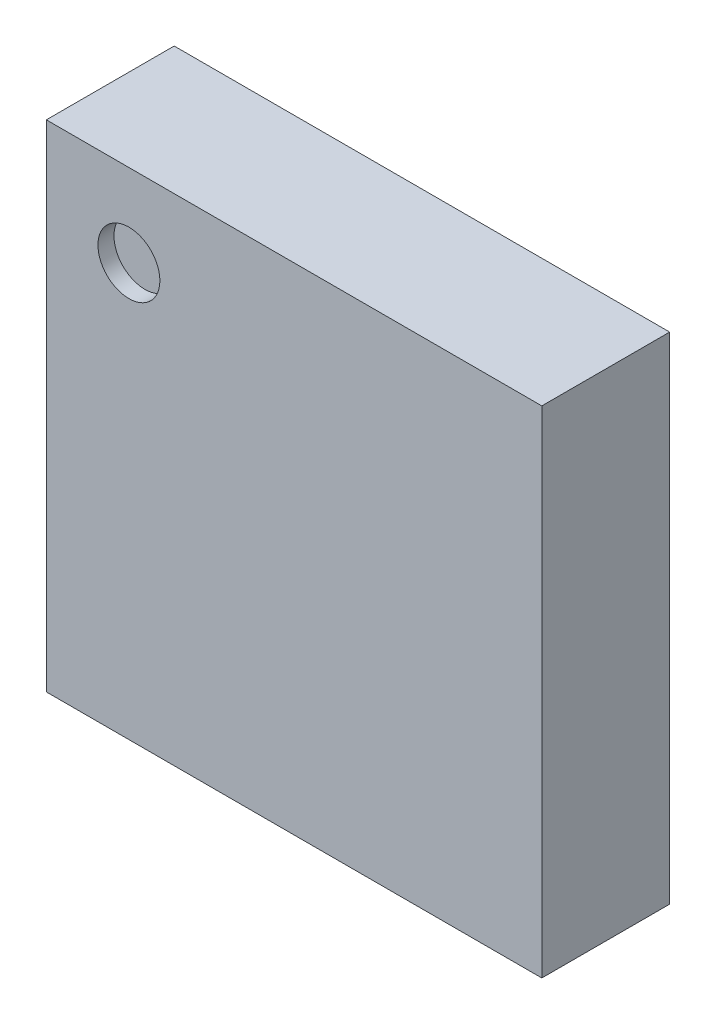
ISO-10303-21;
HEADER;
FILE_DESCRIPTION(('STEP AP214'),'2;1');
FILE_NAME('part.step','',(''),(''),'','','');
FILE_SCHEMA(('AUTOMOTIVE_DESIGN { 1 0 10303 214 1 1 1 1 }'));
ENDSEC;
DATA;
#1=APPLICATION_CONTEXT('core data for automotive mechanical design processes');
#2=APPLICATION_PROTOCOL_DEFINITION('international standard','automotive_design',2000,#1);
#3=PRODUCT_CONTEXT('',#1,'mechanical');
#4=PRODUCT('Part','Part','',(#3));
#5=PRODUCT_RELATED_PRODUCT_CATEGORY('part','',(#4));
#6=PRODUCT_DEFINITION_FORMATION('','',#4);
#7=PRODUCT_DEFINITION_CONTEXT('part definition',#1,'design');
#8=PRODUCT_DEFINITION('design','',#6,#7);
#9=PRODUCT_DEFINITION_SHAPE('','',#8);
#10=(LENGTH_UNIT() NAMED_UNIT(*) SI_UNIT(.MILLI.,.METRE.));
#11=(NAMED_UNIT(*) PLANE_ANGLE_UNIT() SI_UNIT($,.RADIAN.));
#12=(NAMED_UNIT(*) SI_UNIT($,.STERADIAN.) SOLID_ANGLE_UNIT());
#13=UNCERTAINTY_MEASURE_WITH_UNIT(LENGTH_MEASURE(1.E-05),#10,'distance_accuracy_value','');
#14=(GEOMETRIC_REPRESENTATION_CONTEXT(3) GLOBAL_UNCERTAINTY_ASSIGNED_CONTEXT((#13)) GLOBAL_UNIT_ASSIGNED_CONTEXT((#10,
#11,#12)) REPRESENTATION_CONTEXT('',''));
#15=CARTESIAN_POINT('',(0.,0.,0.));
#16=DIRECTION('',(0.,0.,1.));
#17=DIRECTION('',(1.,0.,0.));
#18=AXIS2_PLACEMENT_3D('',#15,#16,#17);
#19=CARTESIAN_POINT('',(0.516666666667,2.583333333333,0.7));
#20=DIRECTION('',(0.,0.,1.));
#21=DIRECTION('',(1.,0.,0.));
#22=AXIS2_PLACEMENT_3D('',#19,#20,#21);
#23=PLANE('',#22);
#24=CARTESIAN_POINT('',(0.516666666667,2.583333333333,0.7));
#25=DIRECTION('',(0.,0.,1.));
#26=DIRECTION('',(1.,0.,0.));
#27=AXIS2_PLACEMENT_3D('',#24,#25,#26);
#28=CIRCLE('',#27,0.19375);
#29=CARTESIAN_POINT('',(0.710416666667,2.583333333333,0.7));
#30=VERTEX_POINT('',#29);
#31=EDGE_CURVE('E20',#30,#30,#28,.T.);
#32=ORIENTED_EDGE('',*,*,#31,.T.);
#33=EDGE_LOOP('',(#32));
#34=FACE_BOUND('',#33,.T.);
#35=ADVANCED_FACE('F17',(#34),#23,.T.);
#36=CARTESIAN_POINT('',(0.516666666667,2.583333333333,0.7));
#37=DIRECTION('',(0.,0.,1.));
#38=DIRECTION('',(1.,0.,0.));
#39=AXIS2_PLACEMENT_3D('',#36,#37,#38);
#40=CYLINDRICAL_SURFACE('',#39,0.19375);
#41=CARTESIAN_POINT('',(0.516666666667,2.583333333333,0.8));
#42=DIRECTION('',(0.,0.,1.));
#43=DIRECTION('',(1.,0.,0.));
#44=AXIS2_PLACEMENT_3D('',#41,#42,#43);
#45=CIRCLE('',#44,0.19375);
#46=CARTESIAN_POINT('',(0.710416666667,2.583333333333,0.8));
#47=VERTEX_POINT('',#46);
#48=EDGE_CURVE('E66',#47,#47,#45,.F.);
#49=ORIENTED_EDGE('',*,*,#48,.F.);
#50=EDGE_LOOP('',(#49));
#51=FACE_BOUND('',#50,.T.);
#52=ORIENTED_EDGE('',*,*,#31,.F.);
#53=EDGE_LOOP('',(#52));
#54=FACE_BOUND('',#53,.T.);
#55=ADVANCED_FACE('F87',(#51,#54),#40,.F.);
#56=CARTESIAN_POINT('',(0.,0.,0.8));
#57=DIRECTION('',(0.,0.,1.));
#58=DIRECTION('',(1.,0.,0.));
#59=AXIS2_PLACEMENT_3D('',#56,#57,#58);
#60=PLANE('',#59);
#61=ORIENTED_EDGE('',*,*,#48,.T.);
#62=EDGE_LOOP('',(#61));
#63=FACE_BOUND('',#62,.T.);
#64=DIRECTION('',(0.,1.,0.));
#65=VECTOR('',#64,1.);
#66=CARTESIAN_POINT('',(3.1,0.,0.8));
#67=LINE('',#66,#65);
#68=CARTESIAN_POINT('',(3.1,3.1,0.8));
#69=VERTEX_POINT('',#68);
#70=CARTESIAN_POINT('',(3.1,0.,0.8));
#71=VERTEX_POINT('',#70);
#72=EDGE_CURVE('E166',#69,#71,#67,.F.);
#73=ORIENTED_EDGE('',*,*,#72,.F.);
#74=DIRECTION('',(1.,0.,0.));
#75=VECTOR('',#74,1.);
#76=CARTESIAN_POINT('',(0.,3.1,0.8));
#77=LINE('',#76,#75);
#78=CARTESIAN_POINT('',(0.,3.1,0.8));
#79=VERTEX_POINT('',#78);
#80=EDGE_CURVE('E60',#79,#69,#77,.T.);
#81=ORIENTED_EDGE('',*,*,#80,.F.);
#82=DIRECTION('',(0.,1.,0.));
#83=VECTOR('',#82,1.);
#84=CARTESIAN_POINT('',(0.,0.,0.8));
#85=LINE('',#84,#83);
#86=CARTESIAN_POINT('',(0.,0.,0.8));
#87=VERTEX_POINT('',#86);
#88=EDGE_CURVE('E58',#79,#87,#85,.F.);
#89=ORIENTED_EDGE('',*,*,#88,.T.);
#90=DIRECTION('',(1.,0.,0.));
#91=VECTOR('',#90,1.);
#92=CARTESIAN_POINT('',(0.,0.,0.8));
#93=LINE('',#92,#91);
#94=EDGE_CURVE('E55',#87,#71,#93,.T.);
#95=ORIENTED_EDGE('',*,*,#94,.T.);
#96=EDGE_LOOP('',(#73,#81,#89,#95));
#97=FACE_BOUND('',#96,.T.);
#98=ADVANCED_FACE('F59',(#63,#97),#60,.T.);
#99=CARTESIAN_POINT('',(0.,0.,0.));
#100=DIRECTION('',(1.,0.,0.));
#101=DIRECTION('',(0.,0.,-1.));
#102=AXIS2_PLACEMENT_3D('',#99,#100,#101);
#103=PLANE('',#102);
#104=DIRECTION('',(0.,0.,1.));
#105=VECTOR('',#104,1.);
#106=CARTESIAN_POINT('',(0.,3.1,0.));
#107=LINE('',#106,#105);
#108=CARTESIAN_POINT('',(0.,3.1,0.));
#109=VERTEX_POINT('',#108);
#110=EDGE_CURVE('E170',#109,#79,#107,.T.);
#111=ORIENTED_EDGE('',*,*,#110,.F.);
#112=DIRECTION('',(0.,1.,0.));
#113=VECTOR('',#112,1.);
#114=CARTESIAN_POINT('',(0.,0.,0.));
#115=LINE('',#114,#113);
#116=CARTESIAN_POINT('',(0.,0.,0.));
#117=VERTEX_POINT('',#116);
#118=EDGE_CURVE('E77',#109,#117,#115,.F.);
#119=ORIENTED_EDGE('',*,*,#118,.T.);
#120=DIRECTION('',(0.,0.,1.));
#121=VECTOR('',#120,1.);
#122=CARTESIAN_POINT('',(0.,0.,0.));
#123=LINE('',#122,#121);
#124=EDGE_CURVE('E65',#117,#87,#123,.T.);
#125=ORIENTED_EDGE('',*,*,#124,.T.);
#126=ORIENTED_EDGE('',*,*,#88,.F.);
#127=EDGE_LOOP('',(#111,#119,#125,#126));
#128=FACE_BOUND('',#127,.T.);
#129=ADVANCED_FACE('F76',(#128),#103,.F.);
#130=CARTESIAN_POINT('',(0.,0.,0.));
#131=DIRECTION('',(0.,1.,0.));
#132=DIRECTION('',(0.,0.,1.));
#133=AXIS2_PLACEMENT_3D('',#130,#131,#132);
#134=PLANE('',#133);
#135=ORIENTED_EDGE('',*,*,#94,.F.);
#136=ORIENTED_EDGE('',*,*,#124,.F.);
#137=DIRECTION('',(1.,0.,0.));
#138=VECTOR('',#137,1.);
#139=CARTESIAN_POINT('',(0.,0.,0.));
#140=LINE('',#139,#138);
#141=CARTESIAN_POINT('',(3.1,0.,0.));
#142=VERTEX_POINT('',#141);
#143=EDGE_CURVE('E168',#117,#142,#140,.T.);
#144=ORIENTED_EDGE('',*,*,#143,.T.);
#145=DIRECTION('',(0.,0.,-1.));
#146=VECTOR('',#145,1.);
#147=CARTESIAN_POINT('',(3.1,0.,0.));
#148=LINE('',#147,#146);
#149=EDGE_CURVE('E73',#71,#142,#148,.T.);
#150=ORIENTED_EDGE('',*,*,#149,.F.);
#151=EDGE_LOOP('',(#135,#136,#144,#150));
#152=FACE_BOUND('',#151,.T.);
#153=ADVANCED_FACE('F70',(#152),#134,.F.);
#154=CARTESIAN_POINT('',(3.1,0.,0.));
#155=DIRECTION('',(1.,0.,0.));
#156=DIRECTION('',(0.,0.,-1.));
#157=AXIS2_PLACEMENT_3D('',#154,#155,#156);
#158=PLANE('',#157);
#159=DIRECTION('',(0.,0.,1.));
#160=VECTOR('',#159,1.);
#161=CARTESIAN_POINT('',(3.1,3.1,0.));
#162=LINE('',#161,#160);
#163=CARTESIAN_POINT('',(3.1,3.1,0.));
#164=VERTEX_POINT('',#163);
#165=EDGE_CURVE('E34',#69,#164,#162,.F.);
#166=ORIENTED_EDGE('',*,*,#165,.F.);
#167=ORIENTED_EDGE('',*,*,#72,.T.);
#168=ORIENTED_EDGE('',*,*,#149,.T.);
#169=DIRECTION('',(0.,1.,0.));
#170=VECTOR('',#169,1.);
#171=CARTESIAN_POINT('',(3.1,0.,0.));
#172=LINE('',#171,#170);
#173=EDGE_CURVE('E26',#142,#164,#172,.T.);
#174=ORIENTED_EDGE('',*,*,#173,.T.);
#175=EDGE_LOOP('',(#166,#167,#168,#174));
#176=FACE_BOUND('',#175,.T.);
#177=ADVANCED_FACE('F104',(#176),#158,.T.);
#178=CARTESIAN_POINT('',(0.,3.1,0.));
#179=DIRECTION('',(0.,1.,0.));
#180=DIRECTION('',(0.,0.,1.));
#181=AXIS2_PLACEMENT_3D('',#178,#179,#180);
#182=PLANE('',#181);
#183=ORIENTED_EDGE('',*,*,#80,.T.);
#184=ORIENTED_EDGE('',*,*,#165,.T.);
#185=DIRECTION('',(1.,0.,0.));
#186=VECTOR('',#185,1.);
#187=CARTESIAN_POINT('',(0.,3.1,0.));
#188=LINE('',#187,#186);
#189=EDGE_CURVE('E11',#164,#109,#188,.F.);
#190=ORIENTED_EDGE('',*,*,#189,.T.);
#191=ORIENTED_EDGE('',*,*,#110,.T.);
#192=EDGE_LOOP('',(#183,#184,#190,#191));
#193=FACE_BOUND('',#192,.T.);
#194=ADVANCED_FACE('F98',(#193),#182,.T.);
#195=CARTESIAN_POINT('',(0.,0.,0.));
#196=DIRECTION('',(0.,0.,1.));
#197=DIRECTION('',(1.,0.,0.));
#198=AXIS2_PLACEMENT_3D('',#195,#196,#197);
#199=PLANE('',#198);
#200=ORIENTED_EDGE('',*,*,#173,.F.);
#201=ORIENTED_EDGE('',*,*,#143,.F.);
#202=ORIENTED_EDGE('',*,*,#118,.F.);
#203=ORIENTED_EDGE('',*,*,#189,.F.);
#204=EDGE_LOOP('',(#200,#201,#202,#203));
#205=FACE_BOUND('',#204,.T.);
#206=ADVANCED_FACE('F96',(#205),#199,.F.);
#207=CLOSED_SHELL('',(#35,#55,#98,#129,#153,#177,#194,#206));
#208=MANIFOLD_SOLID_BREP('B1',#207);
#209=ADVANCED_BREP_SHAPE_REPRESENTATION('',(#18,#208),#14);
#210=SHAPE_DEFINITION_REPRESENTATION(#9,#209);
ENDSEC;
END-ISO-10303-21;
